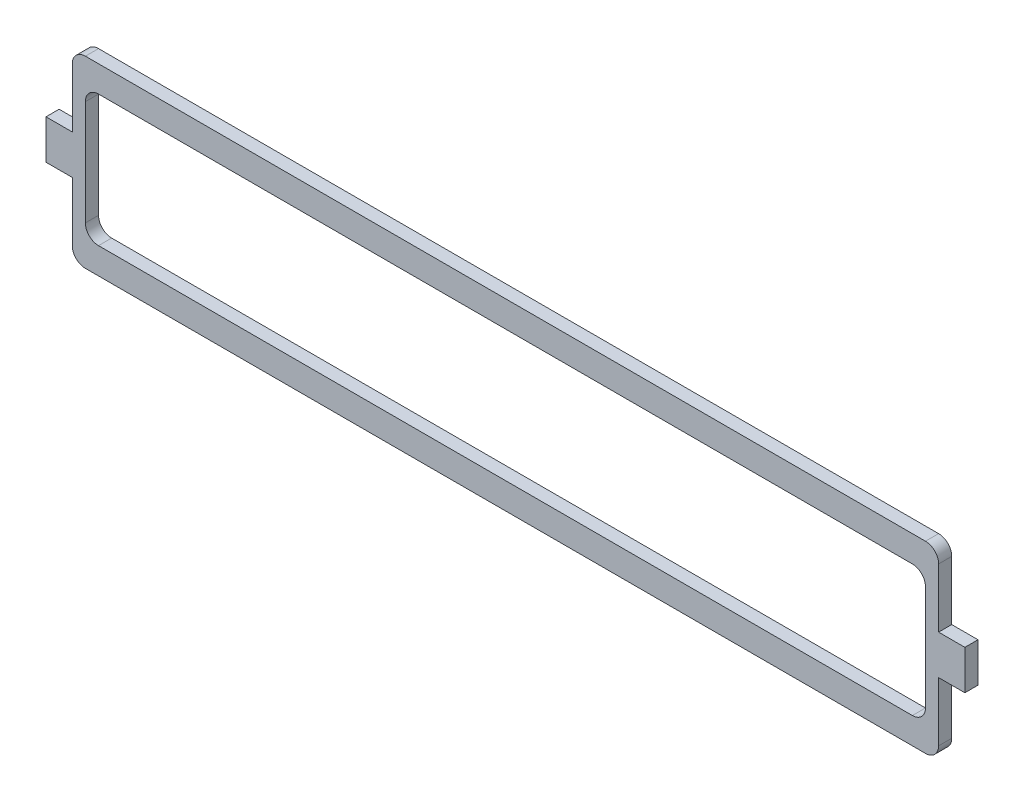
ISO-10303-21;
HEADER;
FILE_DESCRIPTION(('STEP AP214'),'2;1');
FILE_NAME('part.step','',(''),(''),'','','');
FILE_SCHEMA(('AUTOMOTIVE_DESIGN { 1 0 10303 214 1 1 1 1 }'));
ENDSEC;
DATA;
#1=APPLICATION_CONTEXT('core data for automotive mechanical design processes');
#2=APPLICATION_PROTOCOL_DEFINITION('international standard','automotive_design',2000,#1);
#3=PRODUCT_CONTEXT('',#1,'mechanical');
#4=PRODUCT('Part','Part','',(#3));
#5=PRODUCT_RELATED_PRODUCT_CATEGORY('part','',(#4));
#6=PRODUCT_DEFINITION_FORMATION('','',#4);
#7=PRODUCT_DEFINITION_CONTEXT('part definition',#1,'design');
#8=PRODUCT_DEFINITION('design','',#6,#7);
#9=PRODUCT_DEFINITION_SHAPE('','',#8);
#10=(LENGTH_UNIT() NAMED_UNIT(*) SI_UNIT(.MILLI.,.METRE.));
#11=(NAMED_UNIT(*) PLANE_ANGLE_UNIT() SI_UNIT($,.RADIAN.));
#12=(NAMED_UNIT(*) SI_UNIT($,.STERADIAN.) SOLID_ANGLE_UNIT());
#13=UNCERTAINTY_MEASURE_WITH_UNIT(LENGTH_MEASURE(1.E-05),#10,'distance_accuracy_value','');
#14=(GEOMETRIC_REPRESENTATION_CONTEXT(3) GLOBAL_UNCERTAINTY_ASSIGNED_CONTEXT((#13)) GLOBAL_UNIT_ASSIGNED_CONTEXT((#10,
#11,#12)) REPRESENTATION_CONTEXT('',''));
#15=CARTESIAN_POINT('',(0.,0.,0.));
#16=DIRECTION('',(0.,0.,1.));
#17=DIRECTION('',(1.,0.,0.));
#18=AXIS2_PLACEMENT_3D('',#15,#16,#17);
#19=CARTESIAN_POINT('',(-75.8132530120482,17.5,5.));
#20=DIRECTION('',(1.,0.,0.));
#21=DIRECTION('',(0.,0.,-1.));
#22=AXIS2_PLACEMENT_3D('',#19,#20,#21);
#23=PLANE('',#22);
#24=DIRECTION('',(0.,-1.,0.));
#25=VECTOR('',#24,1.);
#26=CARTESIAN_POINT('',(-75.8132530120482,17.5,5.));
#27=LINE('',#26,#25);
#28=CARTESIAN_POINT('',(-75.8132530120482,30.,5.));
#29=VERTEX_POINT('',#28);
#30=CARTESIAN_POINT('',(-75.8132530120482,7.5,5.));
#31=VERTEX_POINT('',#30);
#32=EDGE_CURVE('E193',#29,#31,#27,.T.);
#33=ORIENTED_EDGE('',*,*,#32,.F.);
#34=DIRECTION('',(0.,0.,-1.));
#35=VECTOR('',#34,1.);
#36=CARTESIAN_POINT('',(-75.8132530120482,30.,5.));
#37=LINE('',#36,#35);
#38=CARTESIAN_POINT('',(-75.8132530120482,30.,0.));
#39=VERTEX_POINT('',#38);
#40=EDGE_CURVE('E332',#29,#39,#37,.T.);
#41=ORIENTED_EDGE('',*,*,#40,.T.);
#42=DIRECTION('',(0.,-1.,0.));
#43=VECTOR('',#42,1.);
#44=CARTESIAN_POINT('',(-75.8132530120482,17.5,0.));
#45=LINE('',#44,#43);
#46=CARTESIAN_POINT('',(-75.8132530120482,7.5,0.));
#47=VERTEX_POINT('',#46);
#48=EDGE_CURVE('E211',#39,#47,#45,.T.);
#49=ORIENTED_EDGE('',*,*,#48,.T.);
#50=DIRECTION('',(0.,0.,-1.));
#51=VECTOR('',#50,1.);
#52=CARTESIAN_POINT('',(-75.8132530120482,7.5,5.));
#53=LINE('',#52,#51);
#54=EDGE_CURVE('E209',#31,#47,#53,.T.);
#55=ORIENTED_EDGE('',*,*,#54,.F.);
#56=EDGE_LOOP('',(#33,#41,#49,#55));
#57=FACE_BOUND('',#56,.T.);
#58=ADVANCED_FACE('F33',(#57),#23,.F.);
#59=CARTESIAN_POINT('',(-85.8132530120482,7.5,5.));
#60=DIRECTION('',(0.,-1.,0.));
#61=DIRECTION('',(0.,0.,-1.));
#62=AXIS2_PLACEMENT_3D('',#59,#60,#61);
#63=PLANE('',#62);
#64=DIRECTION('',(-1.,0.,0.));
#65=VECTOR('',#64,1.);
#66=CARTESIAN_POINT('',(-85.8132530120482,7.5,0.));
#67=LINE('',#66,#65);
#68=CARTESIAN_POINT('',(-85.8132530120482,7.5,0.));
#69=VERTEX_POINT('',#68);
#70=EDGE_CURVE('E246',#47,#69,#67,.T.);
#71=ORIENTED_EDGE('',*,*,#70,.T.);
#72=DIRECTION('',(0.,0.,-1.));
#73=VECTOR('',#72,1.);
#74=CARTESIAN_POINT('',(-85.8132530120482,7.5,5.));
#75=LINE('',#74,#73);
#76=CARTESIAN_POINT('',(-85.8132530120482,7.5,5.));
#77=VERTEX_POINT('',#76);
#78=EDGE_CURVE('E215',#77,#69,#75,.T.);
#79=ORIENTED_EDGE('',*,*,#78,.F.);
#80=DIRECTION('',(-1.,0.,0.));
#81=VECTOR('',#80,1.);
#82=CARTESIAN_POINT('',(-85.8132530120482,7.5,5.));
#83=LINE('',#82,#81);
#84=EDGE_CURVE('E198',#31,#77,#83,.T.);
#85=ORIENTED_EDGE('',*,*,#84,.F.);
#86=ORIENTED_EDGE('',*,*,#54,.T.);
#87=EDGE_LOOP('',(#71,#79,#85,#86));
#88=FACE_BOUND('',#87,.T.);
#89=ADVANCED_FACE('F217',(#88),#63,.F.);
#90=CARTESIAN_POINT('',(-85.8132530120482,7.5,5.));
#91=DIRECTION('',(1.,0.,0.));
#92=DIRECTION('',(0.,0.,-1.));
#93=AXIS2_PLACEMENT_3D('',#90,#91,#92);
#94=PLANE('',#93);
#95=DIRECTION('',(0.,-1.,0.));
#96=VECTOR('',#95,1.);
#97=CARTESIAN_POINT('',(-85.8132530120482,7.5,0.));
#98=LINE('',#97,#96);
#99=CARTESIAN_POINT('',(-85.8132530120482,-7.5,0.));
#100=VERTEX_POINT('',#99);
#101=EDGE_CURVE('E249',#69,#100,#98,.T.);
#102=ORIENTED_EDGE('',*,*,#101,.T.);
#103=DIRECTION('',(0.,0.,-1.));
#104=VECTOR('',#103,1.);
#105=CARTESIAN_POINT('',(-85.8132530120482,-7.5,5.));
#106=LINE('',#105,#104);
#107=CARTESIAN_POINT('',(-85.8132530120482,-7.5,5.));
#108=VERTEX_POINT('',#107);
#109=EDGE_CURVE('E287',#108,#100,#106,.T.);
#110=ORIENTED_EDGE('',*,*,#109,.F.);
#111=DIRECTION('',(0.,-1.,0.));
#112=VECTOR('',#111,1.);
#113=CARTESIAN_POINT('',(-85.8132530120482,7.5,5.));
#114=LINE('',#113,#112);
#115=EDGE_CURVE('E220',#77,#108,#114,.T.);
#116=ORIENTED_EDGE('',*,*,#115,.F.);
#117=ORIENTED_EDGE('',*,*,#78,.T.);
#118=EDGE_LOOP('',(#102,#110,#116,#117));
#119=FACE_BOUND('',#118,.T.);
#120=ADVANCED_FACE('F430',(#119),#94,.F.);
#121=CARTESIAN_POINT('',(-85.8132530120482,-7.5,5.));
#122=DIRECTION('',(0.,1.,0.));
#123=DIRECTION('',(0.,0.,1.));
#124=AXIS2_PLACEMENT_3D('',#121,#122,#123);
#125=PLANE('',#124);
#126=DIRECTION('',(1.,0.,0.));
#127=VECTOR('',#126,1.);
#128=CARTESIAN_POINT('',(-85.8132530120482,-7.5,0.));
#129=LINE('',#128,#127);
#130=CARTESIAN_POINT('',(-75.8132530120482,-7.5,0.));
#131=VERTEX_POINT('',#130);
#132=EDGE_CURVE('E251',#100,#131,#129,.T.);
#133=ORIENTED_EDGE('',*,*,#132,.T.);
#134=DIRECTION('',(0.,0.,-1.));
#135=VECTOR('',#134,1.);
#136=CARTESIAN_POINT('',(-75.8132530120482,-7.5,5.));
#137=LINE('',#136,#135);
#138=CARTESIAN_POINT('',(-75.8132530120482,-7.5,5.));
#139=VERTEX_POINT('',#138);
#140=EDGE_CURVE('E284',#139,#131,#137,.T.);
#141=ORIENTED_EDGE('',*,*,#140,.F.);
#142=DIRECTION('',(1.,0.,0.));
#143=VECTOR('',#142,1.);
#144=CARTESIAN_POINT('',(-85.8132530120482,-7.5,5.));
#145=LINE('',#144,#143);
#146=EDGE_CURVE('E222',#108,#139,#145,.T.);
#147=ORIENTED_EDGE('',*,*,#146,.F.);
#148=ORIENTED_EDGE('',*,*,#109,.T.);
#149=EDGE_LOOP('',(#133,#141,#147,#148));
#150=FACE_BOUND('',#149,.T.);
#151=ADVANCED_FACE('F489',(#150),#125,.F.);
#152=CARTESIAN_POINT('',(-75.8132530120482,-17.5,5.));
#153=DIRECTION('',(1.,0.,0.));
#154=DIRECTION('',(0.,1.,0.));
#155=AXIS2_PLACEMENT_3D('',#152,#153,#154);
#156=PLANE('',#155);
#157=DIRECTION('',(0.,-1.,0.));
#158=VECTOR('',#157,1.);
#159=CARTESIAN_POINT('',(-75.8132530120482,-17.5,0.));
#160=LINE('',#159,#158);
#161=CARTESIAN_POINT('',(-75.8132530120482,-30.,0.));
#162=VERTEX_POINT('',#161);
#163=EDGE_CURVE('E254',#131,#162,#160,.T.);
#164=ORIENTED_EDGE('',*,*,#163,.T.);
#165=DIRECTION('',(0.,0.,-1.));
#166=VECTOR('',#165,1.);
#167=CARTESIAN_POINT('',(-75.8132530120482,-30.,5.));
#168=LINE('',#167,#166);
#169=CARTESIAN_POINT('',(-75.8132530120482,-30.,5.));
#170=VERTEX_POINT('',#169);
#171=EDGE_CURVE('E330',#162,#170,#168,.F.);
#172=ORIENTED_EDGE('',*,*,#171,.T.);
#173=DIRECTION('',(0.,-1.,0.));
#174=VECTOR('',#173,1.);
#175=CARTESIAN_POINT('',(-75.8132530120482,-17.5,5.));
#176=LINE('',#175,#174);
#177=EDGE_CURVE('E227',#139,#170,#176,.T.);
#178=ORIENTED_EDGE('',*,*,#177,.F.);
#179=ORIENTED_EDGE('',*,*,#140,.T.);
#180=EDGE_LOOP('',(#164,#172,#178,#179));
#181=FACE_BOUND('',#180,.T.);
#182=ADVANCED_FACE('F491',(#181),#156,.F.);
#183=CARTESIAN_POINT('',(-75.8132530120482,-35.,5.));
#184=DIRECTION('',(0.,1.,0.));
#185=DIRECTION('',(-1.,0.,0.));
#186=AXIS2_PLACEMENT_3D('',#183,#184,#185);
#187=PLANE('',#186);
#188=DIRECTION('',(1.,0.,0.));
#189=VECTOR('',#188,1.);
#190=CARTESIAN_POINT('',(-75.8132530120482,-35.,0.));
#191=LINE('',#190,#189);
#192=CARTESIAN_POINT('',(-70.8132530120482,-35.,0.));
#193=VERTEX_POINT('',#192);
#194=CARTESIAN_POINT('',(249.186746987952,-35.,0.));
#195=VERTEX_POINT('',#194);
#196=EDGE_CURVE('E257',#193,#195,#191,.T.);
#197=ORIENTED_EDGE('',*,*,#196,.T.);
#198=DIRECTION('',(0.,0.,-1.));
#199=VECTOR('',#198,1.);
#200=CARTESIAN_POINT('',(249.186746987952,-35.,5.));
#201=LINE('',#200,#199);
#202=CARTESIAN_POINT('',(249.186746987952,-35.,5.));
#203=VERTEX_POINT('',#202);
#204=EDGE_CURVE('E56',#195,#203,#201,.F.);
#205=ORIENTED_EDGE('',*,*,#204,.T.);
#206=DIRECTION('',(1.,0.,0.));
#207=VECTOR('',#206,1.);
#208=CARTESIAN_POINT('',(-75.8132530120482,-35.,5.));
#209=LINE('',#208,#207);
#210=CARTESIAN_POINT('',(-70.8132530120482,-35.,5.));
#211=VERTEX_POINT('',#210);
#212=EDGE_CURVE('E230',#211,#203,#209,.T.);
#213=ORIENTED_EDGE('',*,*,#212,.F.);
#214=DIRECTION('',(0.,0.,-1.));
#215=VECTOR('',#214,1.);
#216=CARTESIAN_POINT('',(-70.8132530120482,-35.,5.));
#217=LINE('',#216,#215);
#218=EDGE_CURVE('E326',#211,#193,#217,.T.);
#219=ORIENTED_EDGE('',*,*,#218,.T.);
#220=EDGE_LOOP('',(#197,#205,#213,#219));
#221=FACE_BOUND('',#220,.T.);
#222=ADVANCED_FACE('F450',(#221),#187,.F.);
#223=CARTESIAN_POINT('',(254.186746987952,-17.5,5.));
#224=DIRECTION('',(-1.,0.,0.));
#225=DIRECTION('',(0.,0.,1.));
#226=AXIS2_PLACEMENT_3D('',#223,#224,#225);
#227=PLANE('',#226);
#228=DIRECTION('',(0.,1.,0.));
#229=VECTOR('',#228,1.);
#230=CARTESIAN_POINT('',(254.186746987952,-17.5,5.));
#231=LINE('',#230,#229);
#232=CARTESIAN_POINT('',(254.186746987952,-30.,5.));
#233=VERTEX_POINT('',#232);
#234=CARTESIAN_POINT('',(254.186746987952,-7.49999999999996,5.));
#235=VERTEX_POINT('',#234);
#236=EDGE_CURVE('E232',#233,#235,#231,.T.);
#237=ORIENTED_EDGE('',*,*,#236,.F.);
#238=DIRECTION('',(0.,0.,-1.));
#239=VECTOR('',#238,1.);
#240=CARTESIAN_POINT('',(254.186746987952,-30.,5.));
#241=LINE('',#240,#239);
#242=CARTESIAN_POINT('',(254.186746987952,-30.,0.));
#243=VERTEX_POINT('',#242);
#244=EDGE_CURVE('E323',#233,#243,#241,.T.);
#245=ORIENTED_EDGE('',*,*,#244,.T.);
#246=DIRECTION('',(0.,1.,0.));
#247=VECTOR('',#246,1.);
#248=CARTESIAN_POINT('',(254.186746987952,-17.5,0.));
#249=LINE('',#248,#247);
#250=CARTESIAN_POINT('',(254.186746987952,-7.49999999999996,0.));
#251=VERTEX_POINT('',#250);
#252=EDGE_CURVE('E259',#243,#251,#249,.T.);
#253=ORIENTED_EDGE('',*,*,#252,.T.);
#254=DIRECTION('',(0.,0.,-1.));
#255=VECTOR('',#254,1.);
#256=CARTESIAN_POINT('',(254.186746987952,-7.49999999999996,5.));
#257=LINE('',#256,#255);
#258=EDGE_CURVE('E281',#235,#251,#257,.T.);
#259=ORIENTED_EDGE('',*,*,#258,.F.);
#260=EDGE_LOOP('',(#237,#245,#253,#259));
#261=FACE_BOUND('',#260,.T.);
#262=ADVANCED_FACE('F457',(#261),#227,.F.);
#263=CARTESIAN_POINT('',(264.186746987952,-7.50000000000004,5.));
#264=DIRECTION('',(0.,1.,0.));
#265=DIRECTION('',(-1.,0.,0.));
#266=AXIS2_PLACEMENT_3D('',#263,#264,#265);
#267=PLANE('',#266);
#268=DIRECTION('',(1.,0.,0.));
#269=VECTOR('',#268,1.);
#270=CARTESIAN_POINT('',(264.186746987952,-7.50000000000004,0.));
#271=LINE('',#270,#269);
#272=CARTESIAN_POINT('',(264.186746987952,-7.50000000000004,0.));
#273=VERTEX_POINT('',#272);
#274=EDGE_CURVE('E261',#251,#273,#271,.T.);
#275=ORIENTED_EDGE('',*,*,#274,.T.);
#276=DIRECTION('',(0.,0.,-1.));
#277=VECTOR('',#276,1.);
#278=CARTESIAN_POINT('',(264.186746987952,-7.50000000000004,5.));
#279=LINE('',#278,#277);
#280=CARTESIAN_POINT('',(264.186746987952,-7.50000000000004,5.));
#281=VERTEX_POINT('',#280);
#282=EDGE_CURVE('E278',#281,#273,#279,.T.);
#283=ORIENTED_EDGE('',*,*,#282,.F.);
#284=DIRECTION('',(1.,0.,0.));
#285=VECTOR('',#284,1.);
#286=CARTESIAN_POINT('',(264.186746987952,-7.50000000000004,5.));
#287=LINE('',#286,#285);
#288=EDGE_CURVE('E234',#235,#281,#287,.T.);
#289=ORIENTED_EDGE('',*,*,#288,.F.);
#290=ORIENTED_EDGE('',*,*,#258,.T.);
#291=EDGE_LOOP('',(#275,#283,#289,#290));
#292=FACE_BOUND('',#291,.T.);
#293=ADVANCED_FACE('F464',(#292),#267,.F.);
#294=CARTESIAN_POINT('',(264.186746987952,7.50000000000004,5.));
#295=DIRECTION('',(-1.,0.,0.));
#296=DIRECTION('',(0.,0.,1.));
#297=AXIS2_PLACEMENT_3D('',#294,#295,#296);
#298=PLANE('',#297);
#299=DIRECTION('',(0.,1.,0.));
#300=VECTOR('',#299,1.);
#301=CARTESIAN_POINT('',(264.186746987952,7.50000000000004,0.));
#302=LINE('',#301,#300);
#303=CARTESIAN_POINT('',(264.186746987952,7.50000000000004,0.));
#304=VERTEX_POINT('',#303);
#305=EDGE_CURVE('E263',#273,#304,#302,.T.);
#306=ORIENTED_EDGE('',*,*,#305,.T.);
#307=DIRECTION('',(0.,0.,-1.));
#308=VECTOR('',#307,1.);
#309=CARTESIAN_POINT('',(264.186746987952,7.50000000000004,5.));
#310=LINE('',#309,#308);
#311=CARTESIAN_POINT('',(264.186746987952,7.50000000000004,5.));
#312=VERTEX_POINT('',#311);
#313=EDGE_CURVE('E275',#312,#304,#310,.T.);
#314=ORIENTED_EDGE('',*,*,#313,.F.);
#315=DIRECTION('',(0.,1.,0.));
#316=VECTOR('',#315,1.);
#317=CARTESIAN_POINT('',(264.186746987952,7.50000000000004,5.));
#318=LINE('',#317,#316);
#319=EDGE_CURVE('E236',#281,#312,#318,.T.);
#320=ORIENTED_EDGE('',*,*,#319,.F.);
#321=ORIENTED_EDGE('',*,*,#282,.T.);
#322=EDGE_LOOP('',(#306,#314,#320,#321));
#323=FACE_BOUND('',#322,.T.);
#324=ADVANCED_FACE('F467',(#323),#298,.F.);
#325=CARTESIAN_POINT('',(264.186746987952,7.50000000000004,5.));
#326=DIRECTION('',(0.,-1.,0.));
#327=DIRECTION('',(1.,0.,0.));
#328=AXIS2_PLACEMENT_3D('',#325,#326,#327);
#329=PLANE('',#328);
#330=DIRECTION('',(-1.,0.,0.));
#331=VECTOR('',#330,1.);
#332=CARTESIAN_POINT('',(264.186746987952,7.50000000000004,0.));
#333=LINE('',#332,#331);
#334=CARTESIAN_POINT('',(254.186746987952,7.49999999999996,0.));
#335=VERTEX_POINT('',#334);
#336=EDGE_CURVE('E265',#304,#335,#333,.T.);
#337=ORIENTED_EDGE('',*,*,#336,.T.);
#338=DIRECTION('',(0.,0.,-1.));
#339=VECTOR('',#338,1.);
#340=CARTESIAN_POINT('',(254.186746987952,7.49999999999996,5.));
#341=LINE('',#340,#339);
#342=CARTESIAN_POINT('',(254.186746987952,7.49999999999996,5.));
#343=VERTEX_POINT('',#342);
#344=EDGE_CURVE('E244',#343,#335,#341,.T.);
#345=ORIENTED_EDGE('',*,*,#344,.F.);
#346=DIRECTION('',(-1.,0.,0.));
#347=VECTOR('',#346,1.);
#348=CARTESIAN_POINT('',(264.186746987952,7.50000000000004,5.));
#349=LINE('',#348,#347);
#350=EDGE_CURVE('E238',#312,#343,#349,.T.);
#351=ORIENTED_EDGE('',*,*,#350,.F.);
#352=ORIENTED_EDGE('',*,*,#313,.T.);
#353=EDGE_LOOP('',(#337,#345,#351,#352));
#354=FACE_BOUND('',#353,.T.);
#355=ADVANCED_FACE('F472',(#354),#329,.F.);
#356=CARTESIAN_POINT('',(254.186746987952,17.5,5.));
#357=DIRECTION('',(-1.,0.,0.));
#358=DIRECTION('',(0.,0.,1.));
#359=AXIS2_PLACEMENT_3D('',#356,#357,#358);
#360=PLANE('',#359);
#361=DIRECTION('',(0.,1.,0.));
#362=VECTOR('',#361,1.);
#363=CARTESIAN_POINT('',(254.186746987952,17.5,0.));
#364=LINE('',#363,#362);
#365=CARTESIAN_POINT('',(254.186746987952,30.,0.));
#366=VERTEX_POINT('',#365);
#367=EDGE_CURVE('E268',#335,#366,#364,.T.);
#368=ORIENTED_EDGE('',*,*,#367,.T.);
#369=DIRECTION('',(0.,0.,-1.));
#370=VECTOR('',#369,1.);
#371=CARTESIAN_POINT('',(254.186746987952,30.,5.));
#372=LINE('',#371,#370);
#373=CARTESIAN_POINT('',(254.186746987952,30.,5.));
#374=VERTEX_POINT('',#373);
#375=EDGE_CURVE('E315',#366,#374,#372,.F.);
#376=ORIENTED_EDGE('',*,*,#375,.T.);
#377=DIRECTION('',(0.,1.,0.));
#378=VECTOR('',#377,1.);
#379=CARTESIAN_POINT('',(254.186746987952,17.5,5.));
#380=LINE('',#379,#378);
#381=EDGE_CURVE('E240',#343,#374,#380,.T.);
#382=ORIENTED_EDGE('',*,*,#381,.F.);
#383=ORIENTED_EDGE('',*,*,#344,.T.);
#384=EDGE_LOOP('',(#368,#376,#382,#383));
#385=FACE_BOUND('',#384,.T.);
#386=ADVANCED_FACE('F537',(#385),#360,.F.);
#387=CARTESIAN_POINT('',(-75.8132530120482,35.,5.));
#388=DIRECTION('',(0.,-1.,0.));
#389=DIRECTION('',(1.,0.,0.));
#390=AXIS2_PLACEMENT_3D('',#387,#388,#389);
#391=PLANE('',#390);
#392=DIRECTION('',(-1.,0.,0.));
#393=VECTOR('',#392,1.);
#394=CARTESIAN_POINT('',(-75.8132530120482,35.,5.));
#395=LINE('',#394,#393);
#396=CARTESIAN_POINT('',(249.186746987952,35.,5.));
#397=VERTEX_POINT('',#396);
#398=CARTESIAN_POINT('',(-70.8132530120482,35.,5.));
#399=VERTEX_POINT('',#398);
#400=EDGE_CURVE('E242',#397,#399,#395,.T.);
#401=ORIENTED_EDGE('',*,*,#400,.F.);
#402=DIRECTION('',(0.,0.,-1.));
#403=VECTOR('',#402,1.);
#404=CARTESIAN_POINT('',(249.186746987952,35.,5.));
#405=LINE('',#404,#403);
#406=CARTESIAN_POINT('',(249.186746987952,35.,0.));
#407=VERTEX_POINT('',#406);
#408=EDGE_CURVE('E304',#397,#407,#405,.T.);
#409=ORIENTED_EDGE('',*,*,#408,.T.);
#410=DIRECTION('',(-1.,0.,0.));
#411=VECTOR('',#410,1.);
#412=CARTESIAN_POINT('',(-75.8132530120482,35.,0.));
#413=LINE('',#412,#411);
#414=CARTESIAN_POINT('',(-70.8132530120482,35.,0.));
#415=VERTEX_POINT('',#414);
#416=EDGE_CURVE('E206',#407,#415,#413,.T.);
#417=ORIENTED_EDGE('',*,*,#416,.T.);
#418=DIRECTION('',(0.,0.,-1.));
#419=VECTOR('',#418,1.);
#420=CARTESIAN_POINT('',(-70.8132530120482,35.,5.));
#421=LINE('',#420,#419);
#422=EDGE_CURVE('E302',#415,#399,#421,.F.);
#423=ORIENTED_EDGE('',*,*,#422,.T.);
#424=EDGE_LOOP('',(#401,#409,#417,#423));
#425=FACE_BOUND('',#424,.T.);
#426=ADVANCED_FACE('F480',(#425),#391,.F.);
#427=CARTESIAN_POINT('',(0.,0.,5.));
#428=DIRECTION('',(0.,0.,-1.));
#429=DIRECTION('',(-1.,0.,0.));
#430=AXIS2_PLACEMENT_3D('',#427,#428,#429);
#431=PLANE('',#430);
#432=DIRECTION('',(1.,0.,0.));
#433=VECTOR('',#432,1.);
#434=CARTESIAN_POINT('',(-70.8132530120482,-25.,5.));
#435=LINE('',#434,#433);
#436=CARTESIAN_POINT('',(-65.8132530120482,-25.,5.));
#437=VERTEX_POINT('',#436);
#438=CARTESIAN_POINT('',(244.186746987952,-25.,5.));
#439=VERTEX_POINT('',#438);
#440=EDGE_CURVE('E379',#437,#439,#435,.T.);
#441=ORIENTED_EDGE('',*,*,#440,.F.);
#442=CARTESIAN_POINT('',(-65.8132530120482,-20.,5.));
#443=DIRECTION('',(0.,0.,-1.));
#444=DIRECTION('',(-1.,0.,0.));
#445=AXIS2_PLACEMENT_3D('',#442,#443,#444);
#446=CIRCLE('',#445,5.);
#447=CARTESIAN_POINT('',(-70.8132530120482,-20.,5.));
#448=VERTEX_POINT('',#447);
#449=EDGE_CURVE('E358',#437,#448,#446,.T.);
#450=ORIENTED_EDGE('',*,*,#449,.T.);
#451=DIRECTION('',(0.,-1.,0.));
#452=VECTOR('',#451,1.);
#453=CARTESIAN_POINT('',(-70.8132530120482,25.,5.));
#454=LINE('',#453,#452);
#455=CARTESIAN_POINT('',(-70.8132530120482,20.,5.));
#456=VERTEX_POINT('',#455);
#457=EDGE_CURVE('E400',#456,#448,#454,.T.);
#458=ORIENTED_EDGE('',*,*,#457,.F.);
#459=CARTESIAN_POINT('',(-65.8132530120482,20.,5.));
#460=DIRECTION('',(0.,0.,-1.));
#461=DIRECTION('',(-1.,0.,0.));
#462=AXIS2_PLACEMENT_3D('',#459,#460,#461);
#463=CIRCLE('',#462,5.);
#464=CARTESIAN_POINT('',(-65.8132530120482,25.,5.));
#465=VERTEX_POINT('',#464);
#466=EDGE_CURVE('E362',#456,#465,#463,.T.);
#467=ORIENTED_EDGE('',*,*,#466,.T.);
#468=DIRECTION('',(-1.,0.,0.));
#469=VECTOR('',#468,1.);
#470=CARTESIAN_POINT('',(-70.8132530120482,25.,5.));
#471=LINE('',#470,#469);
#472=CARTESIAN_POINT('',(244.186746987952,25.,5.));
#473=VERTEX_POINT('',#472);
#474=EDGE_CURVE('E247',#473,#465,#471,.T.);
#475=ORIENTED_EDGE('',*,*,#474,.F.);
#476=CARTESIAN_POINT('',(244.186746987952,20.,5.));
#477=DIRECTION('',(0.,0.,-1.));
#478=DIRECTION('',(-1.,0.,0.));
#479=AXIS2_PLACEMENT_3D('',#476,#477,#478);
#480=CIRCLE('',#479,5.);
#481=CARTESIAN_POINT('',(249.186746987952,20.,5.));
#482=VERTEX_POINT('',#481);
#483=EDGE_CURVE('E41',#473,#482,#480,.T.);
#484=ORIENTED_EDGE('',*,*,#483,.T.);
#485=DIRECTION('',(0.,1.,0.));
#486=VECTOR('',#485,1.);
#487=CARTESIAN_POINT('',(249.186746987952,25.,5.));
#488=LINE('',#487,#486);
#489=CARTESIAN_POINT('',(249.186746987952,-20.,5.));
#490=VERTEX_POINT('',#489);
#491=EDGE_CURVE('E370',#490,#482,#488,.T.);
#492=ORIENTED_EDGE('',*,*,#491,.F.);
#493=CARTESIAN_POINT('',(244.186746987952,-20.,5.));
#494=DIRECTION('',(0.,0.,-1.));
#495=DIRECTION('',(-1.,0.,0.));
#496=AXIS2_PLACEMENT_3D('',#493,#494,#495);
#497=CIRCLE('',#496,5.);
#498=EDGE_CURVE('E354',#490,#439,#497,.T.);
#499=ORIENTED_EDGE('',*,*,#498,.T.);
#500=EDGE_LOOP('',(#441,#450,#458,#467,#475,#484,#492,#499));
#501=FACE_BOUND('',#500,.T.);
#502=ORIENTED_EDGE('',*,*,#381,.T.);
#503=CARTESIAN_POINT('',(249.186746987952,30.,5.));
#504=DIRECTION('',(0.,0.,-1.));
#505=DIRECTION('',(-1.,0.,0.));
#506=AXIS2_PLACEMENT_3D('',#503,#504,#505);
#507=CIRCLE('',#506,5.);
#508=EDGE_CURVE('E321',#374,#397,#507,.F.);
#509=ORIENTED_EDGE('',*,*,#508,.T.);
#510=ORIENTED_EDGE('',*,*,#400,.T.);
#511=CARTESIAN_POINT('',(-70.8132530120482,30.,5.));
#512=DIRECTION('',(0.,0.,-1.));
#513=DIRECTION('',(-1.,0.,0.));
#514=AXIS2_PLACEMENT_3D('',#511,#512,#513);
#515=CIRCLE('',#514,5.);
#516=EDGE_CURVE('E202',#399,#29,#515,.F.);
#517=ORIENTED_EDGE('',*,*,#516,.T.);
#518=ORIENTED_EDGE('',*,*,#32,.T.);
#519=ORIENTED_EDGE('',*,*,#84,.T.);
#520=ORIENTED_EDGE('',*,*,#115,.T.);
#521=ORIENTED_EDGE('',*,*,#146,.T.);
#522=ORIENTED_EDGE('',*,*,#177,.T.);
#523=CARTESIAN_POINT('',(-70.8132530120482,-30.,5.));
#524=DIRECTION('',(0.,0.,-1.));
#525=DIRECTION('',(-1.,0.,0.));
#526=AXIS2_PLACEMENT_3D('',#523,#524,#525);
#527=CIRCLE('',#526,5.);
#528=EDGE_CURVE('E318',#170,#211,#527,.F.);
#529=ORIENTED_EDGE('',*,*,#528,.T.);
#530=ORIENTED_EDGE('',*,*,#212,.T.);
#531=CARTESIAN_POINT('',(249.186746987952,-30.,5.));
#532=DIRECTION('',(0.,0.,-1.));
#533=DIRECTION('',(-1.,0.,0.));
#534=AXIS2_PLACEMENT_3D('',#531,#532,#533);
#535=CIRCLE('',#534,5.);
#536=EDGE_CURVE('E48',#203,#233,#535,.F.);
#537=ORIENTED_EDGE('',*,*,#536,.T.);
#538=ORIENTED_EDGE('',*,*,#236,.T.);
#539=ORIENTED_EDGE('',*,*,#288,.T.);
#540=ORIENTED_EDGE('',*,*,#319,.T.);
#541=ORIENTED_EDGE('',*,*,#350,.T.);
#542=EDGE_LOOP('',(#502,#509,#510,#517,#518,#519,#520,#521,#522,#529,#530,#537,#538,#539,#540,#541));
#543=FACE_BOUND('',#542,.T.);
#544=ADVANCED_FACE('F196',(#501,#543),#431,.F.);
#545=CARTESIAN_POINT('',(0.,0.,0.));
#546=DIRECTION('',(0.,0.,-1.));
#547=DIRECTION('',(-1.,0.,0.));
#548=AXIS2_PLACEMENT_3D('',#545,#546,#547);
#549=PLANE('',#548);
#550=DIRECTION('',(0.,1.,0.));
#551=VECTOR('',#550,1.);
#552=CARTESIAN_POINT('',(-70.8132530120482,0.,0.));
#553=LINE('',#552,#551);
#554=CARTESIAN_POINT('',(-70.8132530120482,-20.,0.));
#555=VERTEX_POINT('',#554);
#556=CARTESIAN_POINT('',(-70.8132530120482,20.,0.));
#557=VERTEX_POINT('',#556);
#558=EDGE_CURVE('E299',#555,#557,#553,.T.);
#559=ORIENTED_EDGE('',*,*,#558,.F.);
#560=CARTESIAN_POINT('',(-65.8132530120482,-20.,0.));
#561=DIRECTION('',(0.,0.,-1.));
#562=DIRECTION('',(-1.,0.,0.));
#563=AXIS2_PLACEMENT_3D('',#560,#561,#562);
#564=CIRCLE('',#563,5.);
#565=CARTESIAN_POINT('',(-65.8132530120482,-25.,0.));
#566=VERTEX_POINT('',#565);
#567=EDGE_CURVE('E360',#555,#566,#564,.F.);
#568=ORIENTED_EDGE('',*,*,#567,.T.);
#569=DIRECTION('',(-1.,0.,0.));
#570=VECTOR('',#569,1.);
#571=CARTESIAN_POINT('',(0.,-25.,0.));
#572=LINE('',#571,#570);
#573=CARTESIAN_POINT('',(244.186746987952,-25.,0.));
#574=VERTEX_POINT('',#573);
#575=EDGE_CURVE('E214',#574,#566,#572,.T.);
#576=ORIENTED_EDGE('',*,*,#575,.F.);
#577=CARTESIAN_POINT('',(244.186746987952,-20.,0.));
#578=DIRECTION('',(0.,0.,-1.));
#579=DIRECTION('',(-1.,0.,0.));
#580=AXIS2_PLACEMENT_3D('',#577,#578,#579);
#581=CIRCLE('',#580,5.);
#582=CARTESIAN_POINT('',(249.186746987952,-20.,0.));
#583=VERTEX_POINT('',#582);
#584=EDGE_CURVE('E356',#574,#583,#581,.F.);
#585=ORIENTED_EDGE('',*,*,#584,.T.);
#586=DIRECTION('',(0.,-1.,0.));
#587=VECTOR('',#586,1.);
#588=CARTESIAN_POINT('',(249.186746987952,0.,0.));
#589=LINE('',#588,#587);
#590=CARTESIAN_POINT('',(249.186746987952,20.,0.));
#591=VERTEX_POINT('',#590);
#592=EDGE_CURVE('E293',#591,#583,#589,.T.);
#593=ORIENTED_EDGE('',*,*,#592,.F.);
#594=CARTESIAN_POINT('',(244.186746987952,20.,0.));
#595=DIRECTION('',(0.,0.,-1.));
#596=DIRECTION('',(-1.,0.,0.));
#597=AXIS2_PLACEMENT_3D('',#594,#595,#596);
#598=CIRCLE('',#597,5.);
#599=CARTESIAN_POINT('',(244.186746987952,25.,0.));
#600=VERTEX_POINT('',#599);
#601=EDGE_CURVE('E11',#591,#600,#598,.F.);
#602=ORIENTED_EDGE('',*,*,#601,.T.);
#603=DIRECTION('',(1.,0.,0.));
#604=VECTOR('',#603,1.);
#605=CARTESIAN_POINT('',(0.,25.,0.));
#606=LINE('',#605,#604);
#607=CARTESIAN_POINT('',(-65.8132530120482,25.,0.));
#608=VERTEX_POINT('',#607);
#609=EDGE_CURVE('E296',#608,#600,#606,.T.);
#610=ORIENTED_EDGE('',*,*,#609,.F.);
#611=CARTESIAN_POINT('',(-65.8132530120482,20.,0.));
#612=DIRECTION('',(0.,0.,-1.));
#613=DIRECTION('',(-1.,0.,0.));
#614=AXIS2_PLACEMENT_3D('',#611,#612,#613);
#615=CIRCLE('',#614,5.);
#616=EDGE_CURVE('E364',#608,#557,#615,.F.);
#617=ORIENTED_EDGE('',*,*,#616,.T.);
#618=EDGE_LOOP('',(#559,#568,#576,#585,#593,#602,#610,#617));
#619=FACE_BOUND('',#618,.T.);
#620=ORIENTED_EDGE('',*,*,#416,.F.);
#621=CARTESIAN_POINT('',(249.186746987952,30.,0.));
#622=DIRECTION('',(0.,0.,-1.));
#623=DIRECTION('',(-1.,0.,0.));
#624=AXIS2_PLACEMENT_3D('',#621,#622,#623);
#625=CIRCLE('',#624,5.);
#626=EDGE_CURVE('E313',#407,#366,#625,.T.);
#627=ORIENTED_EDGE('',*,*,#626,.T.);
#628=ORIENTED_EDGE('',*,*,#367,.F.);
#629=ORIENTED_EDGE('',*,*,#336,.F.);
#630=ORIENTED_EDGE('',*,*,#305,.F.);
#631=ORIENTED_EDGE('',*,*,#274,.F.);
#632=ORIENTED_EDGE('',*,*,#252,.F.);
#633=CARTESIAN_POINT('',(249.186746987952,-30.,0.));
#634=DIRECTION('',(0.,0.,-1.));
#635=DIRECTION('',(-1.,0.,0.));
#636=AXIS2_PLACEMENT_3D('',#633,#634,#635);
#637=CIRCLE('',#636,5.);
#638=EDGE_CURVE('E311',#243,#195,#637,.T.);
#639=ORIENTED_EDGE('',*,*,#638,.T.);
#640=ORIENTED_EDGE('',*,*,#196,.F.);
#641=CARTESIAN_POINT('',(-70.8132530120482,-30.,0.));
#642=DIRECTION('',(0.,0.,-1.));
#643=DIRECTION('',(-1.,0.,0.));
#644=AXIS2_PLACEMENT_3D('',#641,#642,#643);
#645=CIRCLE('',#644,5.);
#646=EDGE_CURVE('E309',#193,#162,#645,.T.);
#647=ORIENTED_EDGE('',*,*,#646,.T.);
#648=ORIENTED_EDGE('',*,*,#163,.F.);
#649=ORIENTED_EDGE('',*,*,#132,.F.);
#650=ORIENTED_EDGE('',*,*,#101,.F.);
#651=ORIENTED_EDGE('',*,*,#70,.F.);
#652=ORIENTED_EDGE('',*,*,#48,.F.);
#653=CARTESIAN_POINT('',(-70.8132530120482,30.,0.));
#654=DIRECTION('',(0.,0.,-1.));
#655=DIRECTION('',(-1.,0.,0.));
#656=AXIS2_PLACEMENT_3D('',#653,#654,#655);
#657=CIRCLE('',#656,5.);
#658=EDGE_CURVE('E307',#39,#415,#657,.T.);
#659=ORIENTED_EDGE('',*,*,#658,.T.);
#660=EDGE_LOOP('',(#620,#627,#628,#629,#630,#631,#632,#639,#640,#647,#648,#649,#650,#651,#652,#659));
#661=FACE_BOUND('',#660,.T.);
#662=ADVANCED_FACE('F385',(#619,#661),#549,.T.);
#663=CARTESIAN_POINT('',(-70.8132530120482,25.,-5.));
#664=DIRECTION('',(-1.,0.,0.));
#665=DIRECTION('',(0.,0.,1.));
#666=AXIS2_PLACEMENT_3D('',#663,#664,#665);
#667=PLANE('',#666);
#668=ORIENTED_EDGE('',*,*,#457,.T.);
#669=DIRECTION('',(0.,0.,1.));
#670=VECTOR('',#669,1.);
#671=CARTESIAN_POINT('',(-70.8132530120482,-20.,0.));
#672=LINE('',#671,#670);
#673=EDGE_CURVE('E347',#448,#555,#672,.F.);
#674=ORIENTED_EDGE('',*,*,#673,.T.);
#675=ORIENTED_EDGE('',*,*,#558,.T.);
#676=DIRECTION('',(0.,0.,1.));
#677=VECTOR('',#676,1.);
#678=CARTESIAN_POINT('',(-70.8132530120482,20.,5.));
#679=LINE('',#678,#677);
#680=EDGE_CURVE('E344',#557,#456,#679,.T.);
#681=ORIENTED_EDGE('',*,*,#680,.T.);
#682=EDGE_LOOP('',(#668,#674,#675,#681));
#683=FACE_BOUND('',#682,.T.);
#684=ADVANCED_FACE('F397',(#683),#667,.F.);
#685=CARTESIAN_POINT('',(-70.8132530120482,25.,-5.));
#686=DIRECTION('',(0.,1.,0.));
#687=DIRECTION('',(0.,0.,1.));
#688=AXIS2_PLACEMENT_3D('',#685,#686,#687);
#689=PLANE('',#688);
#690=ORIENTED_EDGE('',*,*,#474,.T.);
#691=DIRECTION('',(0.,0.,1.));
#692=VECTOR('',#691,1.);
#693=CARTESIAN_POINT('',(-65.8132530120482,25.,0.));
#694=LINE('',#693,#692);
#695=EDGE_CURVE('E352',#465,#608,#694,.F.);
#696=ORIENTED_EDGE('',*,*,#695,.T.);
#697=ORIENTED_EDGE('',*,*,#609,.T.);
#698=DIRECTION('',(0.,0.,1.));
#699=VECTOR('',#698,1.);
#700=CARTESIAN_POINT('',(244.186746987952,25.,5.));
#701=LINE('',#700,#699);
#702=EDGE_CURVE('E349',#600,#473,#701,.T.);
#703=ORIENTED_EDGE('',*,*,#702,.T.);
#704=EDGE_LOOP('',(#690,#696,#697,#703));
#705=FACE_BOUND('',#704,.T.);
#706=ADVANCED_FACE('F389',(#705),#689,.F.);
#707=CARTESIAN_POINT('',(249.186746987952,25.,-5.));
#708=DIRECTION('',(1.,0.,0.));
#709=DIRECTION('',(0.,0.,-1.));
#710=AXIS2_PLACEMENT_3D('',#707,#708,#709);
#711=PLANE('',#710);
#712=ORIENTED_EDGE('',*,*,#592,.T.);
#713=DIRECTION('',(0.,0.,1.));
#714=VECTOR('',#713,1.);
#715=CARTESIAN_POINT('',(249.186746987952,-20.,5.));
#716=LINE('',#715,#714);
#717=EDGE_CURVE('E336',#583,#490,#716,.T.);
#718=ORIENTED_EDGE('',*,*,#717,.T.);
#719=ORIENTED_EDGE('',*,*,#491,.T.);
#720=DIRECTION('',(0.,0.,1.));
#721=VECTOR('',#720,1.);
#722=CARTESIAN_POINT('',(249.186746987952,20.,0.));
#723=LINE('',#722,#721);
#724=EDGE_CURVE('E334',#482,#591,#723,.F.);
#725=ORIENTED_EDGE('',*,*,#724,.T.);
#726=EDGE_LOOP('',(#712,#718,#719,#725));
#727=FACE_BOUND('',#726,.T.);
#728=ADVANCED_FACE('F376',(#727),#711,.F.);
#729=CARTESIAN_POINT('',(-70.8132530120482,-25.,-5.));
#730=DIRECTION('',(0.,-1.,0.));
#731=DIRECTION('',(0.,0.,-1.));
#732=AXIS2_PLACEMENT_3D('',#729,#730,#731);
#733=PLANE('',#732);
#734=ORIENTED_EDGE('',*,*,#440,.T.);
#735=DIRECTION('',(0.,0.,1.));
#736=VECTOR('',#735,1.);
#737=CARTESIAN_POINT('',(244.186746987952,-25.,0.));
#738=LINE('',#737,#736);
#739=EDGE_CURVE('E342',#439,#574,#738,.F.);
#740=ORIENTED_EDGE('',*,*,#739,.T.);
#741=ORIENTED_EDGE('',*,*,#575,.T.);
#742=DIRECTION('',(0.,0.,1.));
#743=VECTOR('',#742,1.);
#744=CARTESIAN_POINT('',(-65.8132530120482,-25.,5.));
#745=LINE('',#744,#743);
#746=EDGE_CURVE('E339',#566,#437,#745,.T.);
#747=ORIENTED_EDGE('',*,*,#746,.T.);
#748=EDGE_LOOP('',(#734,#740,#741,#747));
#749=FACE_BOUND('',#748,.T.);
#750=ADVANCED_FACE('F408',(#749),#733,.F.);
#751=CARTESIAN_POINT('',(249.186746987952,30.,5.));
#752=DIRECTION('',(0.,0.,-1.));
#753=DIRECTION('',(-1.,0.,0.));
#754=AXIS2_PLACEMENT_3D('',#751,#752,#753);
#755=CYLINDRICAL_SURFACE('',#754,5.);
#756=ORIENTED_EDGE('',*,*,#508,.F.);
#757=ORIENTED_EDGE('',*,*,#375,.F.);
#758=ORIENTED_EDGE('',*,*,#626,.F.);
#759=ORIENTED_EDGE('',*,*,#408,.F.);
#760=EDGE_LOOP('',(#756,#757,#758,#759));
#761=FACE_BOUND('',#760,.T.);
#762=ADVANCED_FACE('F434',(#761),#755,.T.);
#763=CARTESIAN_POINT('',(249.186746987952,-30.,5.));
#764=DIRECTION('',(0.,0.,-1.));
#765=DIRECTION('',(-1.,0.,0.));
#766=AXIS2_PLACEMENT_3D('',#763,#764,#765);
#767=CYLINDRICAL_SURFACE('',#766,5.);
#768=ORIENTED_EDGE('',*,*,#536,.F.);
#769=ORIENTED_EDGE('',*,*,#204,.F.);
#770=ORIENTED_EDGE('',*,*,#638,.F.);
#771=ORIENTED_EDGE('',*,*,#244,.F.);
#772=EDGE_LOOP('',(#768,#769,#770,#771));
#773=FACE_BOUND('',#772,.T.);
#774=ADVANCED_FACE('F437',(#773),#767,.T.);
#775=CARTESIAN_POINT('',(-70.8132530120482,-30.,5.));
#776=DIRECTION('',(0.,0.,-1.));
#777=DIRECTION('',(-1.,0.,0.));
#778=AXIS2_PLACEMENT_3D('',#775,#776,#777);
#779=CYLINDRICAL_SURFACE('',#778,5.);
#780=ORIENTED_EDGE('',*,*,#528,.F.);
#781=ORIENTED_EDGE('',*,*,#171,.F.);
#782=ORIENTED_EDGE('',*,*,#646,.F.);
#783=ORIENTED_EDGE('',*,*,#218,.F.);
#784=EDGE_LOOP('',(#780,#781,#782,#783));
#785=FACE_BOUND('',#784,.T.);
#786=ADVANCED_FACE('F422',(#785),#779,.T.);
#787=CARTESIAN_POINT('',(-70.8132530120482,30.,5.));
#788=DIRECTION('',(0.,0.,-1.));
#789=DIRECTION('',(-1.,0.,0.));
#790=AXIS2_PLACEMENT_3D('',#787,#788,#789);
#791=CYLINDRICAL_SURFACE('',#790,5.);
#792=ORIENTED_EDGE('',*,*,#516,.F.);
#793=ORIENTED_EDGE('',*,*,#422,.F.);
#794=ORIENTED_EDGE('',*,*,#658,.F.);
#795=ORIENTED_EDGE('',*,*,#40,.F.);
#796=EDGE_LOOP('',(#792,#793,#794,#795));
#797=FACE_BOUND('',#796,.T.);
#798=ADVANCED_FACE('F415',(#797),#791,.T.);
#799=CARTESIAN_POINT('',(244.186746987952,-20.,-5.));
#800=DIRECTION('',(0.,0.,-1.));
#801=DIRECTION('',(-1.,0.,0.));
#802=AXIS2_PLACEMENT_3D('',#799,#800,#801);
#803=CYLINDRICAL_SURFACE('',#802,5.);
#804=ORIENTED_EDGE('',*,*,#584,.F.);
#805=ORIENTED_EDGE('',*,*,#739,.F.);
#806=ORIENTED_EDGE('',*,*,#498,.F.);
#807=ORIENTED_EDGE('',*,*,#717,.F.);
#808=EDGE_LOOP('',(#804,#805,#806,#807));
#809=FACE_BOUND('',#808,.T.);
#810=ADVANCED_FACE('F411',(#809),#803,.F.);
#811=CARTESIAN_POINT('',(-65.8132530120482,-20.,-5.));
#812=DIRECTION('',(0.,0.,-1.));
#813=DIRECTION('',(-1.,0.,0.));
#814=AXIS2_PLACEMENT_3D('',#811,#812,#813);
#815=CYLINDRICAL_SURFACE('',#814,5.);
#816=ORIENTED_EDGE('',*,*,#567,.F.);
#817=ORIENTED_EDGE('',*,*,#673,.F.);
#818=ORIENTED_EDGE('',*,*,#449,.F.);
#819=ORIENTED_EDGE('',*,*,#746,.F.);
#820=EDGE_LOOP('',(#816,#817,#818,#819));
#821=FACE_BOUND('',#820,.T.);
#822=ADVANCED_FACE('F402',(#821),#815,.F.);
#823=CARTESIAN_POINT('',(-65.8132530120482,20.,-5.));
#824=DIRECTION('',(0.,0.,-1.));
#825=DIRECTION('',(-1.,0.,0.));
#826=AXIS2_PLACEMENT_3D('',#823,#824,#825);
#827=CYLINDRICAL_SURFACE('',#826,5.);
#828=ORIENTED_EDGE('',*,*,#616,.F.);
#829=ORIENTED_EDGE('',*,*,#695,.F.);
#830=ORIENTED_EDGE('',*,*,#466,.F.);
#831=ORIENTED_EDGE('',*,*,#680,.F.);
#832=EDGE_LOOP('',(#828,#829,#830,#831));
#833=FACE_BOUND('',#832,.T.);
#834=ADVANCED_FACE('F392',(#833),#827,.F.);
#835=CARTESIAN_POINT('',(244.186746987952,20.,-5.));
#836=DIRECTION('',(0.,0.,-1.));
#837=DIRECTION('',(-1.,0.,0.));
#838=AXIS2_PLACEMENT_3D('',#835,#836,#837);
#839=CYLINDRICAL_SURFACE('',#838,5.);
#840=ORIENTED_EDGE('',*,*,#601,.F.);
#841=ORIENTED_EDGE('',*,*,#724,.F.);
#842=ORIENTED_EDGE('',*,*,#483,.F.);
#843=ORIENTED_EDGE('',*,*,#702,.F.);
#844=EDGE_LOOP('',(#840,#841,#842,#843));
#845=FACE_BOUND('',#844,.T.);
#846=ADVANCED_FACE('F35',(#845),#839,.F.);
#847=CLOSED_SHELL('',(#58,#89,#120,#151,#182,#222,#262,#293,#324,#355,#386,#426,#544,#662,#684,
#706,#728,#750,#762,#774,#786,#798,#810,#822,#834,#846));
#848=MANIFOLD_SOLID_BREP('B2',#847);
#849=ADVANCED_BREP_SHAPE_REPRESENTATION('',(#18,#848),#14);
#850=SHAPE_DEFINITION_REPRESENTATION(#9,#849);
ENDSEC;
END-ISO-10303-21;
